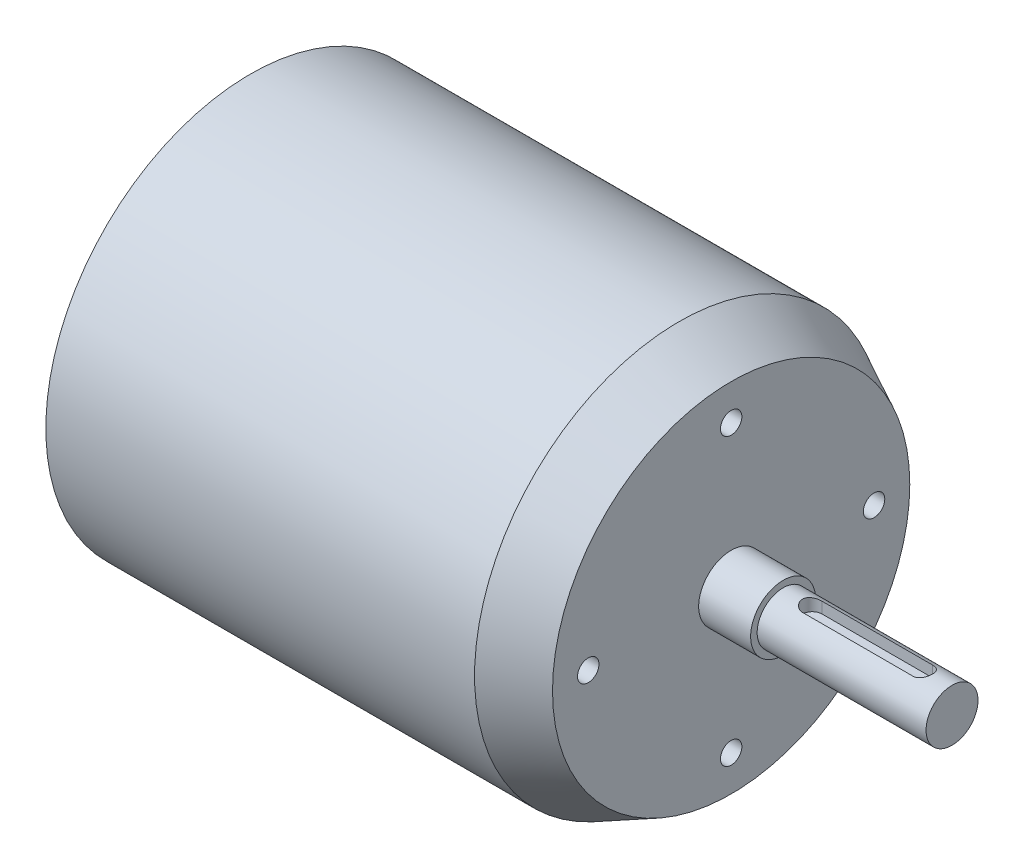
ISO-10303-21;
HEADER;
FILE_DESCRIPTION(('STEP AP214'),'2;1');
FILE_NAME('part.step','',(''),(''),'','','');
FILE_SCHEMA(('AUTOMOTIVE_DESIGN { 1 0 10303 214 1 1 1 1 }'));
ENDSEC;
DATA;
#1=APPLICATION_CONTEXT('core data for automotive mechanical design processes');
#2=APPLICATION_PROTOCOL_DEFINITION('international standard','automotive_design',2000,#1);
#3=PRODUCT_CONTEXT('',#1,'mechanical');
#4=PRODUCT('Part','Part','',(#3));
#5=PRODUCT_RELATED_PRODUCT_CATEGORY('part','',(#4));
#6=PRODUCT_DEFINITION_FORMATION('','',#4);
#7=PRODUCT_DEFINITION_CONTEXT('part definition',#1,'design');
#8=PRODUCT_DEFINITION('design','',#6,#7);
#9=PRODUCT_DEFINITION_SHAPE('','',#8);
#10=(LENGTH_UNIT() NAMED_UNIT(*) SI_UNIT(.MILLI.,.METRE.));
#11=(NAMED_UNIT(*) PLANE_ANGLE_UNIT() SI_UNIT($,.RADIAN.));
#12=(NAMED_UNIT(*) SI_UNIT($,.STERADIAN.) SOLID_ANGLE_UNIT());
#13=UNCERTAINTY_MEASURE_WITH_UNIT(LENGTH_MEASURE(1.E-05),#10,'distance_accuracy_value','');
#14=(GEOMETRIC_REPRESENTATION_CONTEXT(3) GLOBAL_UNCERTAINTY_ASSIGNED_CONTEXT((#13)) GLOBAL_UNIT_ASSIGNED_CONTEXT((#10,
#11,#12)) REPRESENTATION_CONTEXT('',''));
#15=CARTESIAN_POINT('',(0.,0.,0.));
#16=DIRECTION('',(0.,0.,1.));
#17=DIRECTION('',(1.,0.,0.));
#18=AXIS2_PLACEMENT_3D('',#15,#16,#17);
#19=CARTESIAN_POINT('',(0.,0.,0.));
#20=DIRECTION('',(1.,0.,0.));
#21=DIRECTION('',(0.,0.,-1.));
#22=AXIS2_PLACEMENT_3D('',#19,#20,#21);
#23=PLANE('',#22);
#24=CARTESIAN_POINT('',(0.,0.,0.));
#25=DIRECTION('',(1.,0.,0.));
#26=DIRECTION('',(0.,0.,-1.));
#27=AXIS2_PLACEMENT_3D('',#24,#25,#26);
#28=CIRCLE('',#27,5.);
#29=CARTESIAN_POINT('',(0.,0.,-5.));
#30=VERTEX_POINT('',#29);
#31=EDGE_CURVE('E267',#30,#30,#28,.T.);
#32=ORIENTED_EDGE('',*,*,#31,.F.);
#33=EDGE_LOOP('',(#32));
#34=FACE_BOUND('',#33,.T.);
#35=CARTESIAN_POINT('',(0.,0.,22.));
#36=DIRECTION('',(1.,0.,0.));
#37=DIRECTION('',(0.,0.,-1.));
#38=AXIS2_PLACEMENT_3D('',#35,#36,#37);
#39=CIRCLE('',#38,1.65);
#40=CARTESIAN_POINT('',(0.,0.,20.35));
#41=VERTEX_POINT('',#40);
#42=EDGE_CURVE('E163',#41,#41,#39,.T.);
#43=ORIENTED_EDGE('',*,*,#42,.F.);
#44=EDGE_LOOP('',(#43));
#45=FACE_BOUND('',#44,.T.);
#46=CARTESIAN_POINT('',(0.,-22.,0.));
#47=DIRECTION('',(1.,0.,0.));
#48=DIRECTION('',(0.,0.,-1.));
#49=AXIS2_PLACEMENT_3D('',#46,#47,#48);
#50=CIRCLE('',#49,1.65);
#51=CARTESIAN_POINT('',(0.,-22.,-1.65));
#52=VERTEX_POINT('',#51);
#53=EDGE_CURVE('E155',#52,#52,#50,.T.);
#54=ORIENTED_EDGE('',*,*,#53,.F.);
#55=EDGE_LOOP('',(#54));
#56=FACE_BOUND('',#55,.T.);
#57=CARTESIAN_POINT('',(0.,0.,-22.));
#58=DIRECTION('',(1.,0.,0.));
#59=DIRECTION('',(0.,0.,-1.));
#60=AXIS2_PLACEMENT_3D('',#57,#58,#59);
#61=CIRCLE('',#60,1.65);
#62=CARTESIAN_POINT('',(0.,0.,-23.65));
#63=VERTEX_POINT('',#62);
#64=EDGE_CURVE('E139',#63,#63,#61,.T.);
#65=ORIENTED_EDGE('',*,*,#64,.F.);
#66=EDGE_LOOP('',(#65));
#67=FACE_BOUND('',#66,.T.);
#68=CARTESIAN_POINT('',(0.,22.,0.));
#69=DIRECTION('',(1.,0.,0.));
#70=DIRECTION('',(0.,0.,-1.));
#71=AXIS2_PLACEMENT_3D('',#68,#69,#70);
#72=CIRCLE('',#71,1.65);
#73=CARTESIAN_POINT('',(0.,22.,-1.65));
#74=VERTEX_POINT('',#73);
#75=EDGE_CURVE('E140',#74,#74,#72,.T.);
#76=ORIENTED_EDGE('',*,*,#75,.F.);
#77=EDGE_LOOP('',(#76));
#78=FACE_BOUND('',#77,.T.);
#79=CARTESIAN_POINT('',(0.,0.,0.));
#80=DIRECTION('',(1.,0.,0.));
#81=DIRECTION('',(0.,0.,-1.));
#82=AXIS2_PLACEMENT_3D('',#79,#80,#81);
#83=CIRCLE('',#82,27.5);
#84=CARTESIAN_POINT('',(0.,0.,-27.5));
#85=VERTEX_POINT('',#84);
#86=EDGE_CURVE('E310',#85,#85,#83,.T.);
#87=ORIENTED_EDGE('',*,*,#86,.T.);
#88=EDGE_LOOP('',(#87));
#89=FACE_BOUND('',#88,.T.);
#90=ADVANCED_FACE('F76',(#34,#45,#56,#67,#78,#89),#23,.T.);
#91=CARTESIAN_POINT('',(34.,0.,0.));
#92=DIRECTION('',(-1.,0.,0.));
#93=DIRECTION('',(0.,0.,1.));
#94=AXIS2_PLACEMENT_3D('',#91,#92,#93);
#95=CYLINDRICAL_SURFACE('',#94,4.);
#96=CARTESIAN_POINT('',(34.,0.,0.));
#97=DIRECTION('',(1.,0.,0.));
#98=DIRECTION('',(0.,0.,-1.));
#99=AXIS2_PLACEMENT_3D('',#96,#97,#98);
#100=CIRCLE('',#99,4.);
#101=CARTESIAN_POINT('',(34.,0.,-4.));
#102=VERTEX_POINT('',#101);
#103=EDGE_CURVE('E222',#102,#102,#100,.T.);
#104=ORIENTED_EDGE('',*,*,#103,.F.);
#105=EDGE_LOOP('',(#104));
#106=FACE_BOUND('',#105,.T.);
#107=CARTESIAN_POINT('',(8.,0.,0.));
#108=DIRECTION('',(1.,0.,0.));
#109=DIRECTION('',(0.,0.,-1.));
#110=AXIS2_PLACEMENT_3D('',#107,#108,#109);
#111=CIRCLE('',#110,4.);
#112=CARTESIAN_POINT('',(8.,0.,-4.));
#113=VERTEX_POINT('',#112);
#114=EDGE_CURVE('E262',#113,#113,#111,.T.);
#115=ORIENTED_EDGE('',*,*,#114,.T.);
#116=EDGE_LOOP('',(#115));
#117=FACE_BOUND('',#116,.T.);
#118=DIRECTION('',(-1.,0.,0.));
#119=VECTOR('',#118,1.);
#120=CARTESIAN_POINT('',(34.,3.70809924354783,-1.5));
#121=LINE('',#120,#119);
#122=CARTESIAN_POINT('',(29.5,3.70809924354783,-1.5));
#123=VERTEX_POINT('',#122);
#124=CARTESIAN_POINT('',(12.5,3.70809924354783,-1.5));
#125=VERTEX_POINT('',#124);
#126=EDGE_CURVE('E12',#123,#125,#121,.T.);
#127=ORIENTED_EDGE('',*,*,#126,.F.);
#128=CARTESIAN_POINT('',(29.5,3.70809924354783,1.5));
#129=CARTESIAN_POINT('',(29.5405925330296,3.70809443619348,1.50000149729857));
#130=CARTESIAN_POINT('',(29.5811639292878,3.70876663375751,1.49835118206537));
#131=CARTESIAN_POINT('',(29.6619845387273,3.71141673218275,1.49177905295192));
#132=CARTESIAN_POINT('',(29.7022338554932,3.7133941946446,1.48685833749724));
#133=CARTESIAN_POINT('',(29.8217672157252,3.72118975606221,1.46729482367935));
#134=CARTESIAN_POINT('',(29.9001996602272,3.72887188404209,1.44784998767984));
#135=CARTESIAN_POINT('',(30.0523675185151,3.74825217997878,1.39690233043372));
#136=CARTESIAN_POINT('',(30.1261068290407,3.7599469632381,1.36540966903062));
#137=CARTESIAN_POINT('',(30.2673335200613,3.7860238820009,1.29134097725474));
#138=CARTESIAN_POINT('',(30.3348157220124,3.80040821426565,1.24875587557702));
#139=CARTESIAN_POINT('',(30.4648919199407,3.83103589828726,1.15146603872017));
#140=CARTESIAN_POINT('',(30.5271300143182,3.84733374054252,1.09630269892844));
#141=CARTESIAN_POINT('',(30.6417235930174,3.8794978206844,0.976394584974257));
#142=CARTESIAN_POINT('',(30.6940771643404,3.8953639745168,0.911647960429702));
#143=CARTESIAN_POINT('',(30.7891402142536,3.92552893891845,0.771693719740036));
#144=CARTESIAN_POINT('',(30.8314606006837,3.93975598379754,0.696204968758629));
#145=CARTESIAN_POINT('',(30.9026519110829,3.96438035322528,0.538553622304926));
#146=CARTESIAN_POINT('',(30.9315278494869,3.97477910532575,0.456393528521807));
#147=CARTESIAN_POINT('',(30.9737577188216,3.99018690464435,0.29149005067059));
#148=CARTESIAN_POINT('',(30.987727384304,3.99540906103972,0.208924649211911));
#149=CARTESIAN_POINT('',(31.001721197932,4.00064014015322,0.0424658385808881));
#150=CARTESIAN_POINT('',(31.0017496368019,4.00065066686691,-0.0414271540462108));
#151=CARTESIAN_POINT('',(30.988218193771,3.99559264174045,-0.203744100069408));
#152=CARTESIAN_POINT('',(30.9753305247926,3.99077535168083,-0.282233282883083));
#153=CARTESIAN_POINT('',(30.9374637288878,3.97693262269583,-0.435840275995114));
#154=CARTESIAN_POINT('',(30.9124839153537,3.96790694481372,-0.51095789458693));
#155=CARTESIAN_POINT('',(30.8508296074042,3.94637770601049,-0.656988917196577));
#156=CARTESIAN_POINT('',(30.8139901590766,3.93382542785069,-0.72782519801218));
#157=CARTESIAN_POINT('',(30.7298079624269,3.90651314175191,-0.862486444375066));
#158=CARTESIAN_POINT('',(30.6824617982127,3.89175241632298,-0.926309119580089));
#159=CARTESIAN_POINT('',(30.5753768685089,3.86052643048223,-1.04908600084313));
#160=CARTESIAN_POINT('',(30.515075615665,3.84401196825707,-1.10753779261244));
#161=CARTESIAN_POINT('',(30.3854158656222,3.81182684214318,-1.21369725159035));
#162=CARTESIAN_POINT('',(30.3160538253526,3.79615651174147,-1.26140069584828));
#163=CARTESIAN_POINT('',(30.1682419715862,3.7671186794103,-1.34567998313248));
#164=CARTESIAN_POINT('',(30.0896215943324,3.75381153298453,-1.38197861969246));
#165=CARTESIAN_POINT('',(29.9267936781581,3.73171449181344,-1.44059114536973));
#166=CARTESIAN_POINT('',(29.8425957950671,3.72291700934124,-1.46292853893353));
#167=CARTESIAN_POINT('',(29.7146189823522,3.7140622685257,-1.48519272209728));
#168=CARTESIAN_POINT('',(29.6718976704794,3.71183476402566,-1.49074028414002));
#169=CARTESIAN_POINT('',(29.5861259311283,3.70885093143242,-1.49814308997677));
#170=CARTESIAN_POINT('',(29.5430758469706,3.70809323601798,-1.50000176547338));
#171=CARTESIAN_POINT('',(29.5,3.70809924354783,-1.5));
#172=B_SPLINE_CURVE_WITH_KNOTS('',3,(#128,#129,#130,#131,#132,#133,#134,#135,#136,#137,#138,
#139,#140,#141,#142,#143,#144,#145,#146,#147,#148,#149,#150,#151,#152,#153,#154,#155,#156,#157,
#158,#159,#160,#161,#162,#163,#164,#165,#166,#167,#168,#169,#170,#171),.UNSPECIFIED.,.F.,.F.,(4,
2,2,2,2,2,2,2,2,2,2,2,2,2,2,2,2,2,2,2,2,4),(0.,0.121697465666185,0.243354077586413,
0.485593064591345,0.727628221922016,0.969861938431285,1.22298027419407,1.47614754705134,
1.73793539440997,1.9996255232324,2.25002925199203,2.50035591335681,2.73829765644058,
2.97625291175452,3.21767225141683,3.45917019544674,3.71477993951631,3.97048993642583,
4.23200510445915,4.49307880432491,4.62233004062784,4.75146098044214),.UNSPECIFIED.);
#173=CARTESIAN_POINT('',(29.5,3.70809924354783,1.5));
#174=VERTEX_POINT('',#173);
#175=EDGE_CURVE('E85',#174,#123,#172,.T.);
#176=ORIENTED_EDGE('',*,*,#175,.F.);
#177=DIRECTION('',(-1.,0.,0.));
#178=VECTOR('',#177,1.);
#179=CARTESIAN_POINT('',(34.,3.70809924354783,1.5));
#180=LINE('',#179,#178);
#181=CARTESIAN_POINT('',(12.5,3.70809924354783,1.5));
#182=VERTEX_POINT('',#181);
#183=EDGE_CURVE('E99',#182,#174,#180,.F.);
#184=ORIENTED_EDGE('',*,*,#183,.F.);
#185=CARTESIAN_POINT('',(12.5,3.70809924354783,-1.5));
#186=CARTESIAN_POINT('',(12.4594074669704,3.70809443619348,-1.50000149729856));
#187=CARTESIAN_POINT('',(12.4188360707122,3.70876663375751,-1.49835118206537));
#188=CARTESIAN_POINT('',(12.3380154612727,3.71141673218275,-1.49177905295192));
#189=CARTESIAN_POINT('',(12.2977661445068,3.7133941946446,-1.48685833749724));
#190=CARTESIAN_POINT('',(12.1782327842748,3.72118975606221,-1.46729482367934));
#191=CARTESIAN_POINT('',(12.0998003397728,3.7288718840421,-1.44784998767984));
#192=CARTESIAN_POINT('',(11.9476324814849,3.74825217997878,-1.39690233043372));
#193=CARTESIAN_POINT('',(11.8738931709593,3.75994696323811,-1.36540966903062));
#194=CARTESIAN_POINT('',(11.7326664799387,3.78602388200091,-1.29134097725473));
#195=CARTESIAN_POINT('',(11.6651842779876,3.80040821426565,-1.24875587557702));
#196=CARTESIAN_POINT('',(11.5351080800593,3.83103589828726,-1.15146603872016));
#197=CARTESIAN_POINT('',(11.4728699856818,3.84733374054252,-1.09630269892843));
#198=CARTESIAN_POINT('',(11.3582764069826,3.8794978206844,-0.976394584974255));
#199=CARTESIAN_POINT('',(11.3059228356596,3.8953639745168,-0.9116479604297));
#200=CARTESIAN_POINT('',(11.2108597857464,3.92552893891845,-0.771693719740035));
#201=CARTESIAN_POINT('',(11.1685393993163,3.93975598379754,-0.696204968758628));
#202=CARTESIAN_POINT('',(11.0973480889171,3.96438035322528,-0.538553622304924));
#203=CARTESIAN_POINT('',(11.0684721505131,3.97477910532575,-0.456393528521805));
#204=CARTESIAN_POINT('',(11.0262422811784,3.99018690464435,-0.291490050670587));
#205=CARTESIAN_POINT('',(11.012272615696,3.99540906103972,-0.208924649211909));
#206=CARTESIAN_POINT('',(10.998278802068,4.00064014015322,-0.042465838580887));
#207=CARTESIAN_POINT('',(10.9982503631981,4.00065066686691,0.0414271540462113));
#208=CARTESIAN_POINT('',(11.011781806229,3.99559264174045,0.203744100069408));
#209=CARTESIAN_POINT('',(11.0246694752074,3.99077535168083,0.282233282883083));
#210=CARTESIAN_POINT('',(11.0625362711122,3.97693262269583,0.435840275995115));
#211=CARTESIAN_POINT('',(11.0875160846463,3.96790694481372,0.51095789458693));
#212=CARTESIAN_POINT('',(11.1491703925958,3.94637770601049,0.656988917196577));
#213=CARTESIAN_POINT('',(11.1860098409234,3.93382542785069,0.727825198012179));
#214=CARTESIAN_POINT('',(11.2701920375731,3.90651314175191,0.862486444375065));
#215=CARTESIAN_POINT('',(11.3175382017873,3.89175241632298,0.926309119580088));
#216=CARTESIAN_POINT('',(11.4246231314911,3.86052643048223,1.04908600084313));
#217=CARTESIAN_POINT('',(11.484924384335,3.84401196825707,1.10753779261244));
#218=CARTESIAN_POINT('',(11.6145841343778,3.81182684214318,1.21369725159035));
#219=CARTESIAN_POINT('',(11.6839461746474,3.79615651174147,1.26140069584828));
#220=CARTESIAN_POINT('',(11.8317580284138,3.7671186794103,1.34567998313248));
#221=CARTESIAN_POINT('',(11.9103784056676,3.75381153298453,1.38197861969245));
#222=CARTESIAN_POINT('',(12.0732063218419,3.73171449181344,1.44059114536973));
#223=CARTESIAN_POINT('',(12.157404204933,3.72291700934124,1.46292853893353));
#224=CARTESIAN_POINT('',(12.2853810176478,3.7140622685257,1.48519272209728));
#225=CARTESIAN_POINT('',(12.3281023295206,3.71183476402566,1.49074028414002));
#226=CARTESIAN_POINT('',(12.4138740688717,3.70885093143242,1.49814308997677));
#227=CARTESIAN_POINT('',(12.4569241530294,3.70809323601798,1.50000176547338));
#228=CARTESIAN_POINT('',(12.5,3.70809924354783,1.5));
#229=B_SPLINE_CURVE_WITH_KNOTS('',3,(#185,#186,#187,#188,#189,#190,#191,#192,#193,#194,#195,
#196,#197,#198,#199,#200,#201,#202,#203,#204,#205,#206,#207,#208,#209,#210,#211,#212,#213,#214,
#215,#216,#217,#218,#219,#220,#221,#222,#223,#224,#225,#226,#227,#228),.UNSPECIFIED.,.F.,.F.,(4,
2,2,2,2,2,2,2,2,2,2,2,2,2,2,2,2,2,2,2,2,4),(0.,0.121697465666189,0.243354077586421,
0.485593064591345,0.727628221922012,0.969861938431283,1.22298027419406,1.47614754705134,
1.73793539440997,1.99962552323239,2.25002925199202,2.5003559133568,2.73829765644058,
2.97625291175452,3.21767225141682,3.45917019544674,3.7147799395163,3.97048993642582,
4.23200510445915,4.4930788043249,4.62233004062784,4.75146098044213),.UNSPECIFIED.);
#230=EDGE_CURVE('E228',#125,#182,#229,.T.);
#231=ORIENTED_EDGE('',*,*,#230,.F.);
#232=EDGE_LOOP('',(#127,#176,#184,#231));
#233=FACE_BOUND('',#232,.T.);
#234=ADVANCED_FACE('F232',(#106,#117,#233),#95,.T.);
#235=CARTESIAN_POINT('',(8.,0.,0.));
#236=DIRECTION('',(-1.,0.,0.));
#237=DIRECTION('',(0.,0.,1.));
#238=AXIS2_PLACEMENT_3D('',#235,#236,#237);
#239=CYLINDRICAL_SURFACE('',#238,5.);
#240=CARTESIAN_POINT('',(8.,0.,0.));
#241=DIRECTION('',(1.,0.,0.));
#242=DIRECTION('',(0.,0.,-1.));
#243=AXIS2_PLACEMENT_3D('',#240,#241,#242);
#244=CIRCLE('',#243,5.);
#245=CARTESIAN_POINT('',(8.,0.,-5.));
#246=VERTEX_POINT('',#245);
#247=EDGE_CURVE('E268',#246,#246,#244,.T.);
#248=ORIENTED_EDGE('',*,*,#247,.F.);
#249=EDGE_LOOP('',(#248));
#250=FACE_BOUND('',#249,.T.);
#251=ORIENTED_EDGE('',*,*,#31,.T.);
#252=EDGE_LOOP('',(#251));
#253=FACE_BOUND('',#252,.T.);
#254=ADVANCED_FACE('F285',(#250,#253),#239,.T.);
#255=CARTESIAN_POINT('',(8.,0.,0.));
#256=DIRECTION('',(1.,0.,0.));
#257=DIRECTION('',(0.,0.,-1.));
#258=AXIS2_PLACEMENT_3D('',#255,#256,#257);
#259=PLANE('',#258);
#260=ORIENTED_EDGE('',*,*,#114,.F.);
#261=EDGE_LOOP('',(#260));
#262=FACE_BOUND('',#261,.T.);
#263=ORIENTED_EDGE('',*,*,#247,.T.);
#264=EDGE_LOOP('',(#263));
#265=FACE_BOUND('',#264,.T.);
#266=ADVANCED_FACE('F288',(#262,#265),#259,.T.);
#267=CARTESIAN_POINT('',(34.,0.,0.));
#268=DIRECTION('',(1.,0.,0.));
#269=DIRECTION('',(0.,0.,-1.));
#270=AXIS2_PLACEMENT_3D('',#267,#268,#269);
#271=PLANE('',#270);
#272=ORIENTED_EDGE('',*,*,#103,.T.);
#273=EDGE_LOOP('',(#272));
#274=FACE_BOUND('',#273,.T.);
#275=ADVANCED_FACE('F281',(#274),#271,.T.);
#276=CARTESIAN_POINT('',(12.5,4.,-1.5));
#277=DIRECTION('',(0.,0.,1.));
#278=DIRECTION('',(1.,0.,0.));
#279=AXIS2_PLACEMENT_3D('',#276,#277,#278);
#280=PLANE('',#279);
#281=ORIENTED_EDGE('',*,*,#126,.T.);
#282=DIRECTION('',(0.,-1.,0.));
#283=VECTOR('',#282,1.);
#284=CARTESIAN_POINT('',(12.5,4.,-1.5));
#285=LINE('',#284,#283);
#286=CARTESIAN_POINT('',(12.5,2.,-1.5));
#287=VERTEX_POINT('',#286);
#288=EDGE_CURVE('E177',#125,#287,#285,.T.);
#289=ORIENTED_EDGE('',*,*,#288,.T.);
#290=DIRECTION('',(-1.,0.,0.));
#291=VECTOR('',#290,1.);
#292=CARTESIAN_POINT('',(12.5,2.,-1.5));
#293=LINE('',#292,#291);
#294=CARTESIAN_POINT('',(29.5,2.,-1.5));
#295=VERTEX_POINT('',#294);
#296=EDGE_CURVE('E171',#295,#287,#293,.T.);
#297=ORIENTED_EDGE('',*,*,#296,.F.);
#298=DIRECTION('',(0.,-1.,0.));
#299=VECTOR('',#298,1.);
#300=CARTESIAN_POINT('',(29.5,4.,-1.5));
#301=LINE('',#300,#299);
#302=EDGE_CURVE('E182',#123,#295,#301,.T.);
#303=ORIENTED_EDGE('',*,*,#302,.F.);
#304=EDGE_LOOP('',(#281,#289,#297,#303));
#305=FACE_BOUND('',#304,.T.);
#306=ADVANCED_FACE('F211',(#305),#280,.T.);
#307=CARTESIAN_POINT('',(29.5,4.,0.));
#308=DIRECTION('',(0.,-1.,0.));
#309=DIRECTION('',(0.,0.,-1.));
#310=AXIS2_PLACEMENT_3D('',#307,#308,#309);
#311=CYLINDRICAL_SURFACE('',#310,1.5);
#312=ORIENTED_EDGE('',*,*,#175,.T.);
#313=ORIENTED_EDGE('',*,*,#302,.T.);
#314=CARTESIAN_POINT('',(29.5,2.,0.));
#315=DIRECTION('',(0.,1.,0.));
#316=DIRECTION('',(0.,0.,1.));
#317=AXIS2_PLACEMENT_3D('',#314,#315,#316);
#318=CIRCLE('',#317,1.5);
#319=CARTESIAN_POINT('',(29.5,2.,1.5));
#320=VERTEX_POINT('',#319);
#321=EDGE_CURVE('E181',#320,#295,#318,.T.);
#322=ORIENTED_EDGE('',*,*,#321,.F.);
#323=DIRECTION('',(0.,-1.,0.));
#324=VECTOR('',#323,1.);
#325=CARTESIAN_POINT('',(29.5,4.,1.5));
#326=LINE('',#325,#324);
#327=EDGE_CURVE('E185',#174,#320,#326,.T.);
#328=ORIENTED_EDGE('',*,*,#327,.F.);
#329=EDGE_LOOP('',(#312,#313,#322,#328));
#330=FACE_BOUND('',#329,.T.);
#331=ADVANCED_FACE('F230',(#330),#311,.F.);
#332=CARTESIAN_POINT('',(12.5,4.,1.5));
#333=DIRECTION('',(0.,0.,-1.));
#334=DIRECTION('',(-1.,0.,0.));
#335=AXIS2_PLACEMENT_3D('',#332,#333,#334);
#336=PLANE('',#335);
#337=ORIENTED_EDGE('',*,*,#183,.T.);
#338=ORIENTED_EDGE('',*,*,#327,.T.);
#339=DIRECTION('',(1.,0.,0.));
#340=VECTOR('',#339,1.);
#341=CARTESIAN_POINT('',(12.5,2.,1.5));
#342=LINE('',#341,#340);
#343=CARTESIAN_POINT('',(12.5,2.,1.5));
#344=VERTEX_POINT('',#343);
#345=EDGE_CURVE('E189',#344,#320,#342,.T.);
#346=ORIENTED_EDGE('',*,*,#345,.F.);
#347=DIRECTION('',(0.,-1.,0.));
#348=VECTOR('',#347,1.);
#349=CARTESIAN_POINT('',(12.5,4.,1.5));
#350=LINE('',#349,#348);
#351=EDGE_CURVE('E183',#182,#344,#350,.T.);
#352=ORIENTED_EDGE('',*,*,#351,.F.);
#353=EDGE_LOOP('',(#337,#338,#346,#352));
#354=FACE_BOUND('',#353,.T.);
#355=ADVANCED_FACE('F229',(#354),#336,.T.);
#356=CARTESIAN_POINT('',(12.5,4.,0.));
#357=DIRECTION('',(0.,-1.,0.));
#358=DIRECTION('',(0.,0.,-1.));
#359=AXIS2_PLACEMENT_3D('',#356,#357,#358);
#360=CYLINDRICAL_SURFACE('',#359,1.5);
#361=ORIENTED_EDGE('',*,*,#288,.F.);
#362=ORIENTED_EDGE('',*,*,#230,.T.);
#363=ORIENTED_EDGE('',*,*,#351,.T.);
#364=CARTESIAN_POINT('',(12.5,2.,0.));
#365=DIRECTION('',(0.,1.,0.));
#366=DIRECTION('',(0.,0.,1.));
#367=AXIS2_PLACEMENT_3D('',#364,#365,#366);
#368=CIRCLE('',#367,1.5);
#369=EDGE_CURVE('E219',#287,#344,#368,.T.);
#370=ORIENTED_EDGE('',*,*,#369,.F.);
#371=EDGE_LOOP('',(#361,#362,#363,#370));
#372=FACE_BOUND('',#371,.T.);
#373=ADVANCED_FACE('F227',(#372),#360,.F.);
#374=CARTESIAN_POINT('',(0.,2.,0.));
#375=DIRECTION('',(0.,-1.,0.));
#376=DIRECTION('',(0.,0.,-1.));
#377=AXIS2_PLACEMENT_3D('',#374,#375,#376);
#378=PLANE('',#377);
#379=ORIENTED_EDGE('',*,*,#369,.T.);
#380=ORIENTED_EDGE('',*,*,#345,.T.);
#381=ORIENTED_EDGE('',*,*,#321,.T.);
#382=ORIENTED_EDGE('',*,*,#296,.T.);
#383=EDGE_LOOP('',(#379,#380,#381,#382));
#384=FACE_BOUND('',#383,.T.);
#385=ADVANCED_FACE('F207',(#384),#378,.F.);
#386=CARTESIAN_POINT('',(-5.1,0.,22.));
#387=DIRECTION('',(1.,0.,0.));
#388=DIRECTION('',(0.,0.,-1.));
#389=AXIS2_PLACEMENT_3D('',#386,#387,#388);
#390=CONICAL_SURFACE('',#389,1.65,1.02974425867665);
#391=CARTESIAN_POINT('',(-6.09142002139547,0.,22.));
#392=VERTEX_POINT('',#391);
#393=VERTEX_LOOP('',#392);
#394=FACE_BOUND('',#393,.T.);
#395=CARTESIAN_POINT('',(-5.1,0.,22.));
#396=DIRECTION('',(1.,0.,0.));
#397=DIRECTION('',(0.,0.,-1.));
#398=AXIS2_PLACEMENT_3D('',#395,#396,#397);
#399=CIRCLE('',#398,1.65);
#400=CARTESIAN_POINT('',(-5.1,0.,20.35));
#401=VERTEX_POINT('',#400);
#402=EDGE_CURVE('E167',#401,#401,#399,.T.);
#403=ORIENTED_EDGE('',*,*,#402,.T.);
#404=EDGE_LOOP('',(#403));
#405=FACE_BOUND('',#404,.T.);
#406=ADVANCED_FACE('F353',(#394,#405),#390,.F.);
#407=CARTESIAN_POINT('',(0.,0.,22.));
#408=DIRECTION('',(1.,0.,0.));
#409=DIRECTION('',(0.,0.,-1.));
#410=AXIS2_PLACEMENT_3D('',#407,#408,#409);
#411=CYLINDRICAL_SURFACE('',#410,1.65);
#412=ORIENTED_EDGE('',*,*,#402,.F.);
#413=EDGE_LOOP('',(#412));
#414=FACE_BOUND('',#413,.T.);
#415=ORIENTED_EDGE('',*,*,#42,.T.);
#416=EDGE_LOOP('',(#415));
#417=FACE_BOUND('',#416,.T.);
#418=ADVANCED_FACE('F350',(#414,#417),#411,.F.);
#419=CARTESIAN_POINT('',(-5.1,-22.,0.));
#420=DIRECTION('',(1.,0.,0.));
#421=DIRECTION('',(0.,0.,-1.));
#422=AXIS2_PLACEMENT_3D('',#419,#420,#421);
#423=CONICAL_SURFACE('',#422,1.65,1.02974425867665);
#424=CARTESIAN_POINT('',(-6.09142002139547,-22.,0.));
#425=VERTEX_POINT('',#424);
#426=VERTEX_LOOP('',#425);
#427=FACE_BOUND('',#426,.T.);
#428=CARTESIAN_POINT('',(-5.1,-22.,0.));
#429=DIRECTION('',(1.,0.,0.));
#430=DIRECTION('',(0.,0.,-1.));
#431=AXIS2_PLACEMENT_3D('',#428,#429,#430);
#432=CIRCLE('',#431,1.65);
#433=CARTESIAN_POINT('',(-5.1,-22.,-1.65));
#434=VERTEX_POINT('',#433);
#435=EDGE_CURVE('E159',#434,#434,#432,.T.);
#436=ORIENTED_EDGE('',*,*,#435,.T.);
#437=EDGE_LOOP('',(#436));
#438=FACE_BOUND('',#437,.T.);
#439=ADVANCED_FACE('F346',(#427,#438),#423,.F.);
#440=CARTESIAN_POINT('',(0.,-22.,0.));
#441=DIRECTION('',(1.,0.,0.));
#442=DIRECTION('',(0.,0.,-1.));
#443=AXIS2_PLACEMENT_3D('',#440,#441,#442);
#444=CYLINDRICAL_SURFACE('',#443,1.65);
#445=ORIENTED_EDGE('',*,*,#435,.F.);
#446=EDGE_LOOP('',(#445));
#447=FACE_BOUND('',#446,.T.);
#448=ORIENTED_EDGE('',*,*,#53,.T.);
#449=EDGE_LOOP('',(#448));
#450=FACE_BOUND('',#449,.T.);
#451=ADVANCED_FACE('F342',(#447,#450),#444,.F.);
#452=CARTESIAN_POINT('',(-5.1,0.,-22.));
#453=DIRECTION('',(1.,0.,0.));
#454=DIRECTION('',(0.,0.,-1.));
#455=AXIS2_PLACEMENT_3D('',#452,#453,#454);
#456=CONICAL_SURFACE('',#455,1.65,1.02974425867665);
#457=CARTESIAN_POINT('',(-6.09142002139547,0.,-22.));
#458=VERTEX_POINT('',#457);
#459=VERTEX_LOOP('',#458);
#460=FACE_BOUND('',#459,.T.);
#461=CARTESIAN_POINT('',(-5.1,0.,-22.));
#462=DIRECTION('',(1.,0.,0.));
#463=DIRECTION('',(0.,0.,-1.));
#464=AXIS2_PLACEMENT_3D('',#461,#462,#463);
#465=CIRCLE('',#464,1.65);
#466=CARTESIAN_POINT('',(-5.1,0.,-23.65));
#467=VERTEX_POINT('',#466);
#468=EDGE_CURVE('E145',#467,#467,#465,.T.);
#469=ORIENTED_EDGE('',*,*,#468,.T.);
#470=EDGE_LOOP('',(#469));
#471=FACE_BOUND('',#470,.T.);
#472=ADVANCED_FACE('F338',(#460,#471),#456,.F.);
#473=CARTESIAN_POINT('',(0.,0.,-22.));
#474=DIRECTION('',(1.,0.,0.));
#475=DIRECTION('',(0.,0.,-1.));
#476=AXIS2_PLACEMENT_3D('',#473,#474,#475);
#477=CYLINDRICAL_SURFACE('',#476,1.65);
#478=ORIENTED_EDGE('',*,*,#468,.F.);
#479=EDGE_LOOP('',(#478));
#480=FACE_BOUND('',#479,.T.);
#481=ORIENTED_EDGE('',*,*,#64,.T.);
#482=EDGE_LOOP('',(#481));
#483=FACE_BOUND('',#482,.T.);
#484=ADVANCED_FACE('F132',(#480,#483),#477,.F.);
#485=CARTESIAN_POINT('',(-5.1,22.,0.));
#486=DIRECTION('',(1.,0.,0.));
#487=DIRECTION('',(0.,0.,-1.));
#488=AXIS2_PLACEMENT_3D('',#485,#486,#487);
#489=CONICAL_SURFACE('',#488,1.65,1.02974425867665);
#490=CARTESIAN_POINT('',(-6.09142002139547,22.,0.));
#491=VERTEX_POINT('',#490);
#492=VERTEX_LOOP('',#491);
#493=FACE_BOUND('',#492,.T.);
#494=CARTESIAN_POINT('',(-5.1,22.,0.));
#495=DIRECTION('',(1.,0.,0.));
#496=DIRECTION('',(0.,0.,-1.));
#497=AXIS2_PLACEMENT_3D('',#494,#495,#496);
#498=CIRCLE('',#497,1.65);
#499=CARTESIAN_POINT('',(-5.1,22.,-1.65));
#500=VERTEX_POINT('',#499);
#501=EDGE_CURVE('E136',#500,#500,#498,.T.);
#502=ORIENTED_EDGE('',*,*,#501,.T.);
#503=EDGE_LOOP('',(#502));
#504=FACE_BOUND('',#503,.T.);
#505=ADVANCED_FACE('F128',(#493,#504),#489,.F.);
#506=CARTESIAN_POINT('',(0.,22.,0.));
#507=DIRECTION('',(1.,0.,0.));
#508=DIRECTION('',(0.,0.,-1.));
#509=AXIS2_PLACEMENT_3D('',#506,#507,#508);
#510=CYLINDRICAL_SURFACE('',#509,1.65);
#511=ORIENTED_EDGE('',*,*,#501,.F.);
#512=EDGE_LOOP('',(#511));
#513=FACE_BOUND('',#512,.T.);
#514=ORIENTED_EDGE('',*,*,#75,.T.);
#515=EDGE_LOOP('',(#514));
#516=FACE_BOUND('',#515,.T.);
#517=ADVANCED_FACE('F131',(#513,#516),#510,.F.);
#518=CARTESIAN_POINT('',(-8.,0.,0.));
#519=DIRECTION('',(-1.,0.,0.));
#520=DIRECTION('',(0.,0.,1.));
#521=AXIS2_PLACEMENT_3D('',#518,#519,#520);
#522=CONICAL_SURFACE('',#521,31.5,0.463647609000806);
#523=ORIENTED_EDGE('',*,*,#86,.F.);
#524=EDGE_LOOP('',(#523));
#525=FACE_BOUND('',#524,.T.);
#526=CARTESIAN_POINT('',(-8.,0.,0.));
#527=DIRECTION('',(1.,0.,0.));
#528=DIRECTION('',(0.,0.,-1.));
#529=AXIS2_PLACEMENT_3D('',#526,#527,#528);
#530=CIRCLE('',#529,31.5);
#531=CARTESIAN_POINT('',(-8.,0.,-31.5));
#532=VERTEX_POINT('',#531);
#533=EDGE_CURVE('E148',#532,#532,#530,.T.);
#534=ORIENTED_EDGE('',*,*,#533,.T.);
#535=EDGE_LOOP('',(#534));
#536=FACE_BOUND('',#535,.T.);
#537=ADVANCED_FACE('F318',(#525,#536),#522,.T.);
#538=CARTESIAN_POINT('',(-74.,0.,0.));
#539=DIRECTION('',(1.,0.,0.));
#540=DIRECTION('',(0.,0.,-1.));
#541=AXIS2_PLACEMENT_3D('',#538,#539,#540);
#542=PLANE('',#541);
#543=CARTESIAN_POINT('',(-74.,0.,0.));
#544=DIRECTION('',(1.,0.,0.));
#545=DIRECTION('',(0.,0.,-1.));
#546=AXIS2_PLACEMENT_3D('',#543,#544,#545);
#547=CIRCLE('',#546,31.5);
#548=CARTESIAN_POINT('',(-74.,0.,-31.5));
#549=VERTEX_POINT('',#548);
#550=EDGE_CURVE('E263',#549,#549,#547,.T.);
#551=ORIENTED_EDGE('',*,*,#550,.F.);
#552=EDGE_LOOP('',(#551));
#553=FACE_BOUND('',#552,.T.);
#554=ADVANCED_FACE('F322',(#553),#542,.F.);
#555=CARTESIAN_POINT('',(-74.,0.,0.));
#556=DIRECTION('',(1.,0.,0.));
#557=DIRECTION('',(0.,0.,-1.));
#558=AXIS2_PLACEMENT_3D('',#555,#556,#557);
#559=CYLINDRICAL_SURFACE('',#558,31.5);
#560=ORIENTED_EDGE('',*,*,#533,.F.);
#561=EDGE_LOOP('',(#560));
#562=FACE_BOUND('',#561,.T.);
#563=ORIENTED_EDGE('',*,*,#550,.T.);
#564=EDGE_LOOP('',(#563));
#565=FACE_BOUND('',#564,.T.);
#566=ADVANCED_FACE('F78',(#562,#565),#559,.T.);
#567=CLOSED_SHELL('',(#90,#234,#254,#266,#275,#306,#331,#355,#373,#385,#406,#418,#439,#451,#472,
#484,#505,#517,#537,#554,#566));
#568=MANIFOLD_SOLID_BREP('B2',#567);
#569=ADVANCED_BREP_SHAPE_REPRESENTATION('',(#18,#568),#14);
#570=SHAPE_DEFINITION_REPRESENTATION(#9,#569);
ENDSEC;
END-ISO-10303-21;
